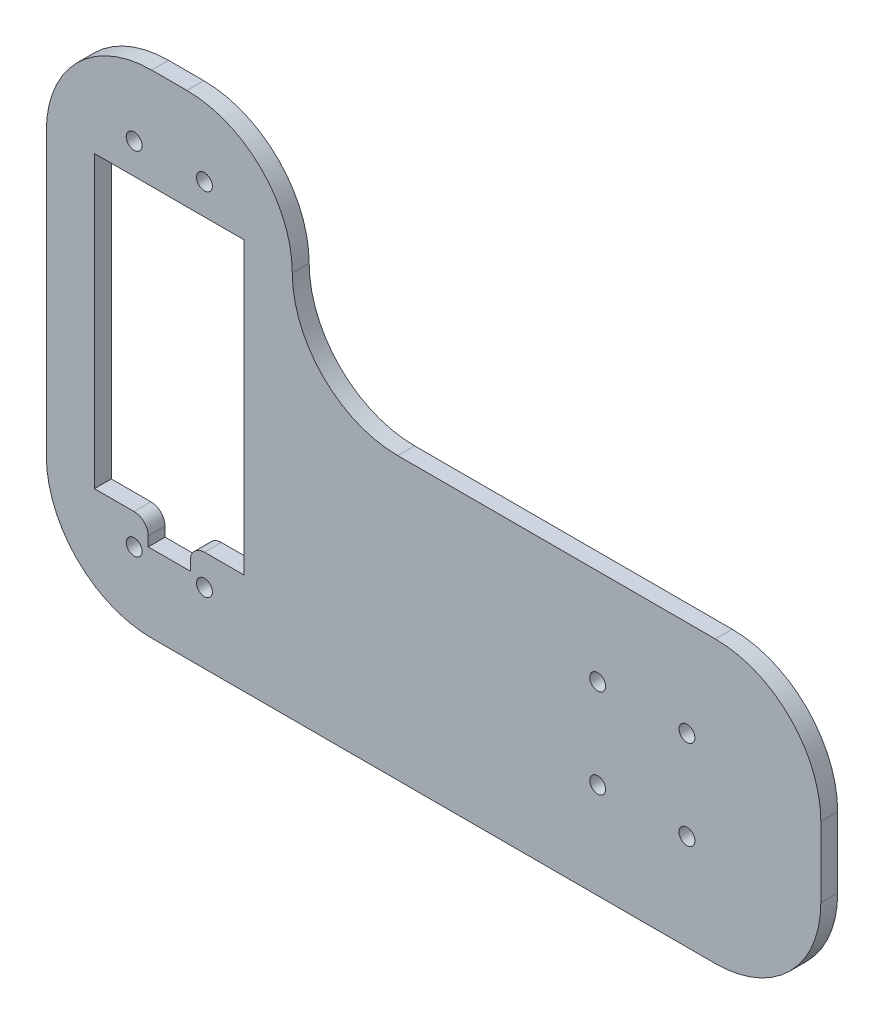
ISO-10303-21;
HEADER;
FILE_DESCRIPTION(('STEP AP214'),'2;1');
FILE_NAME('part.step','',(''),(''),'','','');
FILE_SCHEMA(('AUTOMOTIVE_DESIGN { 1 0 10303 214 1 1 1 1 }'));
ENDSEC;
DATA;
#1=APPLICATION_CONTEXT('core data for automotive mechanical design processes');
#2=APPLICATION_PROTOCOL_DEFINITION('international standard','automotive_design',2000,#1);
#3=PRODUCT_CONTEXT('',#1,'mechanical');
#4=PRODUCT('Part','Part','',(#3));
#5=PRODUCT_RELATED_PRODUCT_CATEGORY('part','',(#4));
#6=PRODUCT_DEFINITION_FORMATION('','',#4);
#7=PRODUCT_DEFINITION_CONTEXT('part definition',#1,'design');
#8=PRODUCT_DEFINITION('design','',#6,#7);
#9=PRODUCT_DEFINITION_SHAPE('','',#8);
#10=(LENGTH_UNIT() NAMED_UNIT(*) SI_UNIT(.MILLI.,.METRE.));
#11=(NAMED_UNIT(*) PLANE_ANGLE_UNIT() SI_UNIT($,.RADIAN.));
#12=(NAMED_UNIT(*) SI_UNIT($,.STERADIAN.) SOLID_ANGLE_UNIT());
#13=UNCERTAINTY_MEASURE_WITH_UNIT(LENGTH_MEASURE(1.E-05),#10,'distance_accuracy_value','');
#14=(GEOMETRIC_REPRESENTATION_CONTEXT(3) GLOBAL_UNCERTAINTY_ASSIGNED_CONTEXT((#13)) GLOBAL_UNIT_ASSIGNED_CONTEXT((#10,
#11,#12)) REPRESENTATION_CONTEXT('',''));
#15=CARTESIAN_POINT('',(0.,0.,0.));
#16=DIRECTION('',(0.,0.,1.));
#17=DIRECTION('',(1.,0.,0.));
#18=AXIS2_PLACEMENT_3D('',#15,#16,#17);
#19=CARTESIAN_POINT('',(0.,0.,2.4));
#20=DIRECTION('',(0.,0.,-1.));
#21=DIRECTION('',(-1.,0.,0.));
#22=AXIS2_PLACEMENT_3D('',#19,#20,#21);
#23=PLANE('',#22);
#24=DIRECTION('',(0.,1.,0.));
#25=VECTOR('',#24,1.);
#26=CARTESIAN_POINT('',(14.1329479768786,-17.9624277456648,2.4));
#27=LINE('',#26,#25);
#28=CARTESIAN_POINT('',(14.1329479768786,-42.9624277456647,2.4));
#29=VERTEX_POINT('',#28);
#30=CARTESIAN_POINT('',(14.1329479768786,-32.9624277456648,2.4));
#31=VERTEX_POINT('',#30);
#32=EDGE_CURVE('E302',#29,#31,#27,.T.);
#33=ORIENTED_EDGE('',*,*,#32,.T.);
#34=CARTESIAN_POINT('',(-0.867052023121387,-32.9624277456648,2.4));
#35=DIRECTION('',(0.,0.,-1.));
#36=DIRECTION('',(-1.,0.,0.));
#37=AXIS2_PLACEMENT_3D('',#34,#35,#36);
#38=CIRCLE('',#37,15.);
#39=CARTESIAN_POINT('',(-0.867052023121387,-17.9624277456648,2.4));
#40=VERTEX_POINT('',#39);
#41=EDGE_CURVE('E367',#31,#40,#38,.F.);
#42=ORIENTED_EDGE('',*,*,#41,.T.);
#43=DIRECTION('',(-1.,0.,0.));
#44=VECTOR('',#43,1.);
#45=CARTESIAN_POINT('',(-61.0670520231214,-17.9624277456648,2.4));
#46=LINE('',#45,#44);
#47=CARTESIAN_POINT('',(-46.0670520231214,-17.9624277456648,2.4));
#48=VERTEX_POINT('',#47);
#49=EDGE_CURVE('E305',#40,#48,#46,.T.);
#50=ORIENTED_EDGE('',*,*,#49,.T.);
#51=CARTESIAN_POINT('',(-46.0670520231214,-2.96242774566476,2.4));
#52=DIRECTION('',(0.,0.,-1.));
#53=DIRECTION('',(-1.,0.,0.));
#54=AXIS2_PLACEMENT_3D('',#51,#52,#53);
#55=CIRCLE('',#54,15.);
#56=CARTESIAN_POINT('',(-61.0670520231214,-2.96242774566475,2.4));
#57=VERTEX_POINT('',#56);
#58=EDGE_CURVE('E11',#48,#57,#55,.T.);
#59=ORIENTED_EDGE('',*,*,#58,.T.);
#60=CARTESIAN_POINT('',(-76.0670520231214,-2.96242774566476,2.4));
#61=DIRECTION('',(0.,0.,-1.));
#62=DIRECTION('',(-1.,0.,0.));
#63=AXIS2_PLACEMENT_3D('',#60,#61,#62);
#64=CIRCLE('',#63,15.);
#65=CARTESIAN_POINT('',(-76.0670520231214,12.0375722543352,2.4));
#66=VERTEX_POINT('',#65);
#67=EDGE_CURVE('E55',#57,#66,#64,.F.);
#68=ORIENTED_EDGE('',*,*,#67,.T.);
#69=DIRECTION('',(-1.,0.,0.));
#70=VECTOR('',#69,1.);
#71=CARTESIAN_POINT('',(-96.0670520231214,12.0375722543352,2.4));
#72=LINE('',#71,#70);
#73=CARTESIAN_POINT('',(-81.0670520231214,12.0375722543352,2.4));
#74=VERTEX_POINT('',#73);
#75=EDGE_CURVE('E308',#66,#74,#72,.T.);
#76=ORIENTED_EDGE('',*,*,#75,.T.);
#77=CARTESIAN_POINT('',(-81.0670520231214,-2.96242774566476,2.4));
#78=DIRECTION('',(0.,0.,-1.));
#79=DIRECTION('',(-1.,0.,0.));
#80=AXIS2_PLACEMENT_3D('',#77,#78,#79);
#81=CIRCLE('',#80,15.);
#82=CARTESIAN_POINT('',(-96.0670520231214,-2.96242774566476,2.4));
#83=VERTEX_POINT('',#82);
#84=EDGE_CURVE('E360',#74,#83,#81,.F.);
#85=ORIENTED_EDGE('',*,*,#84,.T.);
#86=DIRECTION('',(0.,-1.,0.));
#87=VECTOR('',#86,1.);
#88=CARTESIAN_POINT('',(-96.0670520231214,-57.9624277456648,2.4));
#89=LINE('',#88,#87);
#90=CARTESIAN_POINT('',(-96.0670520231214,-42.9624277456648,2.4));
#91=VERTEX_POINT('',#90);
#92=EDGE_CURVE('E295',#83,#91,#89,.T.);
#93=ORIENTED_EDGE('',*,*,#92,.T.);
#94=CARTESIAN_POINT('',(-81.0670520231214,-42.9624277456648,2.4));
#95=DIRECTION('',(0.,0.,-1.));
#96=DIRECTION('',(-1.,0.,0.));
#97=AXIS2_PLACEMENT_3D('',#94,#95,#96);
#98=CIRCLE('',#97,15.);
#99=CARTESIAN_POINT('',(-81.0670520231214,-57.9624277456648,2.4));
#100=VERTEX_POINT('',#99);
#101=EDGE_CURVE('E363',#91,#100,#98,.F.);
#102=ORIENTED_EDGE('',*,*,#101,.T.);
#103=DIRECTION('',(1.,0.,0.));
#104=VECTOR('',#103,1.);
#105=CARTESIAN_POINT('',(14.1329479768786,-57.9624277456647,2.4));
#106=LINE('',#105,#104);
#107=CARTESIAN_POINT('',(-0.867052023121383,-57.9624277456647,2.4));
#108=VERTEX_POINT('',#107);
#109=EDGE_CURVE('E298',#100,#108,#106,.T.);
#110=ORIENTED_EDGE('',*,*,#109,.T.);
#111=CARTESIAN_POINT('',(-0.867052023121389,-42.9624277456647,2.4));
#112=DIRECTION('',(0.,0.,-1.));
#113=DIRECTION('',(-1.,0.,0.));
#114=AXIS2_PLACEMENT_3D('',#111,#112,#113);
#115=CIRCLE('',#114,15.);
#116=EDGE_CURVE('E365',#108,#29,#115,.F.);
#117=ORIENTED_EDGE('',*,*,#116,.T.);
#118=EDGE_LOOP('',(#33,#42,#50,#59,#68,#76,#85,#93,#102,#110,#117));
#119=FACE_BOUND('',#118,.T.);
#120=DIRECTION('',(1.,0.,0.));
#121=VECTOR('',#120,1.);
#122=CARTESIAN_POINT('',(-89.2170520231214,-43.6124277456648,2.4));
#123=LINE('',#122,#121);
#124=CARTESIAN_POINT('',(-73.5670520231214,-43.6124277456648,2.4));
#125=VERTEX_POINT('',#124);
#126=CARTESIAN_POINT('',(-67.9170520231214,-43.6124277456648,2.4));
#127=VERTEX_POINT('',#126);
#128=EDGE_CURVE('E215',#125,#127,#123,.T.);
#129=ORIENTED_EDGE('',*,*,#128,.F.);
#130=CARTESIAN_POINT('',(-73.5670520231214,-45.6124277456648,2.4));
#131=DIRECTION('',(0.,0.,-1.));
#132=DIRECTION('',(-1.,0.,0.));
#133=AXIS2_PLACEMENT_3D('',#130,#131,#132);
#134=CIRCLE('',#133,2.);
#135=CARTESIAN_POINT('',(-75.5670520231214,-45.6124277456648,2.4));
#136=VERTEX_POINT('',#135);
#137=EDGE_CURVE('E333',#125,#136,#134,.F.);
#138=ORIENTED_EDGE('',*,*,#137,.T.);
#139=DIRECTION('',(0.,1.,0.));
#140=VECTOR('',#139,1.);
#141=CARTESIAN_POINT('',(-75.5670520231214,-42.9624277456648,2.4));
#142=LINE('',#141,#140);
#143=CARTESIAN_POINT('',(-75.5670520231214,-46.9624277456648,2.4));
#144=VERTEX_POINT('',#143);
#145=EDGE_CURVE('E230',#144,#136,#142,.T.);
#146=ORIENTED_EDGE('',*,*,#145,.F.);
#147=DIRECTION('',(1.,0.,0.));
#148=VECTOR('',#147,1.);
#149=CARTESIAN_POINT('',(-81.5670520231214,-46.9624277456648,2.4));
#150=LINE('',#149,#148);
#151=CARTESIAN_POINT('',(-81.5670520231214,-46.9624277456648,2.4));
#152=VERTEX_POINT('',#151);
#153=EDGE_CURVE('E237',#152,#144,#150,.T.);
#154=ORIENTED_EDGE('',*,*,#153,.F.);
#155=DIRECTION('',(0.,-1.,0.));
#156=VECTOR('',#155,1.);
#157=CARTESIAN_POINT('',(-81.5670520231214,-42.9624277456648,2.4));
#158=LINE('',#157,#156);
#159=CARTESIAN_POINT('',(-81.5670520231214,-45.6124277456648,2.4));
#160=VERTEX_POINT('',#159);
#161=EDGE_CURVE('E222',#160,#152,#158,.T.);
#162=ORIENTED_EDGE('',*,*,#161,.F.);
#163=CARTESIAN_POINT('',(-83.5670520231214,-45.6124277456648,2.4));
#164=DIRECTION('',(0.,0.,-1.));
#165=DIRECTION('',(-1.,0.,0.));
#166=AXIS2_PLACEMENT_3D('',#163,#164,#165);
#167=CIRCLE('',#166,2.);
#168=CARTESIAN_POINT('',(-83.5670520231214,-43.6124277456648,2.4));
#169=VERTEX_POINT('',#168);
#170=EDGE_CURVE('E331',#160,#169,#167,.F.);
#171=ORIENTED_EDGE('',*,*,#170,.T.);
#172=CARTESIAN_POINT('',(-89.2170520231214,-43.6124277456648,2.4));
#173=VERTEX_POINT('',#172);
#174=EDGE_CURVE('E216',#173,#169,#123,.T.);
#175=ORIENTED_EDGE('',*,*,#174,.F.);
#176=DIRECTION('',(0.,-1.,0.));
#177=VECTOR('',#176,1.);
#178=CARTESIAN_POINT('',(-89.2170520231214,-2.31242774566476,2.4));
#179=LINE('',#178,#177);
#180=CARTESIAN_POINT('',(-89.2170520231214,-2.31242774566476,2.4));
#181=VERTEX_POINT('',#180);
#182=EDGE_CURVE('E184',#181,#173,#179,.T.);
#183=ORIENTED_EDGE('',*,*,#182,.F.);
#184=DIRECTION('',(-1.,0.,0.));
#185=VECTOR('',#184,1.);
#186=CARTESIAN_POINT('',(-89.2170520231214,-2.31242774566476,2.4));
#187=LINE('',#186,#185);
#188=CARTESIAN_POINT('',(-67.9170520231214,-2.31242774566476,2.4));
#189=VERTEX_POINT('',#188);
#190=EDGE_CURVE('E206',#189,#181,#187,.T.);
#191=ORIENTED_EDGE('',*,*,#190,.F.);
#192=DIRECTION('',(0.,1.,0.));
#193=VECTOR('',#192,1.);
#194=CARTESIAN_POINT('',(-67.9170520231214,-2.31242774566476,2.4));
#195=LINE('',#194,#193);
#196=EDGE_CURVE('E209',#127,#189,#195,.T.);
#197=ORIENTED_EDGE('',*,*,#196,.F.);
#198=EDGE_LOOP('',(#129,#138,#146,#154,#162,#171,#175,#183,#191,#197));
#199=FACE_BOUND('',#198,.T.);
#200=CARTESIAN_POINT('',(-4.91705202312138,-31.6124277456648,2.4));
#201=DIRECTION('',(0.,0.,1.));
#202=DIRECTION('',(1.,0.,0.));
#203=AXIS2_PLACEMENT_3D('',#200,#201,#202);
#204=CIRCLE('',#203,1.13);
#205=CARTESIAN_POINT('',(-3.78705202312138,-31.6124277456648,2.4));
#206=VERTEX_POINT('',#205);
#207=EDGE_CURVE('E289',#206,#206,#204,.T.);
#208=ORIENTED_EDGE('',*,*,#207,.F.);
#209=EDGE_LOOP('',(#208));
#210=FACE_BOUND('',#209,.T.);
#211=CARTESIAN_POINT('',(-17.6170520231214,-31.6124277456648,2.4));
#212=DIRECTION('',(0.,0.,1.));
#213=DIRECTION('',(-1.,0.,0.));
#214=AXIS2_PLACEMENT_3D('',#211,#212,#213);
#215=CIRCLE('',#214,1.13);
#216=CARTESIAN_POINT('',(-18.7470520231214,-31.6124277456648,2.4));
#217=VERTEX_POINT('',#216);
#218=EDGE_CURVE('E283',#217,#217,#215,.T.);
#219=ORIENTED_EDGE('',*,*,#218,.F.);
#220=EDGE_LOOP('',(#219));
#221=FACE_BOUND('',#220,.T.);
#222=CARTESIAN_POINT('',(-73.5670520231214,-47.9624277456648,2.4));
#223=DIRECTION('',(0.,0.,1.));
#224=DIRECTION('',(1.,0.,0.));
#225=AXIS2_PLACEMENT_3D('',#222,#223,#224);
#226=CIRCLE('',#225,1.13000000000001);
#227=CARTESIAN_POINT('',(-72.4370520231214,-47.9624277456648,2.4));
#228=VERTEX_POINT('',#227);
#229=EDGE_CURVE('E277',#228,#228,#226,.T.);
#230=ORIENTED_EDGE('',*,*,#229,.F.);
#231=EDGE_LOOP('',(#230));
#232=FACE_BOUND('',#231,.T.);
#233=CARTESIAN_POINT('',(-17.6170520231214,-44.3124277456647,2.4));
#234=DIRECTION('',(0.,0.,1.));
#235=DIRECTION('',(1.,0.,0.));
#236=AXIS2_PLACEMENT_3D('',#233,#234,#235);
#237=CIRCLE('',#236,1.13);
#238=CARTESIAN_POINT('',(-16.4870520231214,-44.3124277456647,2.4));
#239=VERTEX_POINT('',#238);
#240=EDGE_CURVE('E271',#239,#239,#237,.T.);
#241=ORIENTED_EDGE('',*,*,#240,.F.);
#242=EDGE_LOOP('',(#241));
#243=FACE_BOUND('',#242,.T.);
#244=CARTESIAN_POINT('',(-4.91705202312138,-44.3124277456647,2.4));
#245=DIRECTION('',(0.,0.,1.));
#246=DIRECTION('',(-1.,0.,0.));
#247=AXIS2_PLACEMENT_3D('',#244,#245,#246);
#248=CIRCLE('',#247,1.13);
#249=CARTESIAN_POINT('',(-6.04705202312139,-44.3124277456647,2.4));
#250=VERTEX_POINT('',#249);
#251=EDGE_CURVE('E265',#250,#250,#248,.T.);
#252=ORIENTED_EDGE('',*,*,#251,.F.);
#253=EDGE_LOOP('',(#252));
#254=FACE_BOUND('',#253,.T.);
#255=CARTESIAN_POINT('',(-73.5670520231214,2.03757225433524,2.4));
#256=DIRECTION('',(0.,0.,1.));
#257=DIRECTION('',(1.,0.,0.));
#258=AXIS2_PLACEMENT_3D('',#255,#256,#257);
#259=CIRCLE('',#258,1.13000000000001);
#260=CARTESIAN_POINT('',(-72.4370520231214,2.03757225433524,2.4));
#261=VERTEX_POINT('',#260);
#262=EDGE_CURVE('E259',#261,#261,#259,.T.);
#263=ORIENTED_EDGE('',*,*,#262,.F.);
#264=EDGE_LOOP('',(#263));
#265=FACE_BOUND('',#264,.T.);
#266=CARTESIAN_POINT('',(-83.5670520231214,2.03757225433524,2.4));
#267=DIRECTION('',(0.,0.,1.));
#268=DIRECTION('',(-1.,0.,0.));
#269=AXIS2_PLACEMENT_3D('',#266,#267,#268);
#270=CIRCLE('',#269,1.13);
#271=CARTESIAN_POINT('',(-84.6970520231214,2.03757225433524,2.4));
#272=VERTEX_POINT('',#271);
#273=EDGE_CURVE('E253',#272,#272,#270,.T.);
#274=ORIENTED_EDGE('',*,*,#273,.F.);
#275=EDGE_LOOP('',(#274));
#276=FACE_BOUND('',#275,.T.);
#277=CARTESIAN_POINT('',(-83.5670520231214,-47.9624277456648,2.4));
#278=DIRECTION('',(0.,0.,1.));
#279=DIRECTION('',(-1.,0.,0.));
#280=AXIS2_PLACEMENT_3D('',#277,#278,#279);
#281=CIRCLE('',#280,1.12999999999999);
#282=CARTESIAN_POINT('',(-84.6970520231214,-47.9624277456648,2.4));
#283=VERTEX_POINT('',#282);
#284=EDGE_CURVE('E247',#283,#283,#281,.T.);
#285=ORIENTED_EDGE('',*,*,#284,.F.);
#286=EDGE_LOOP('',(#285));
#287=FACE_BOUND('',#286,.T.);
#288=ADVANCED_FACE('F33',(#119,#199,#210,#221,#232,#243,#254,#265,#276,#287),#23,.F.);
#289=CARTESIAN_POINT('',(0.,0.,0.));
#290=DIRECTION('',(0.,0.,-1.));
#291=DIRECTION('',(-1.,0.,0.));
#292=AXIS2_PLACEMENT_3D('',#289,#290,#291);
#293=PLANE('',#292);
#294=DIRECTION('',(0.,1.,0.));
#295=VECTOR('',#294,1.);
#296=CARTESIAN_POINT('',(-75.5670520231214,-42.9624277456648,0.));
#297=LINE('',#296,#295);
#298=CARTESIAN_POINT('',(-75.5670520231214,-46.9624277456648,0.));
#299=VERTEX_POINT('',#298);
#300=CARTESIAN_POINT('',(-75.5670520231214,-45.6124277456648,0.));
#301=VERTEX_POINT('',#300);
#302=EDGE_CURVE('E233',#299,#301,#297,.T.);
#303=ORIENTED_EDGE('',*,*,#302,.T.);
#304=CARTESIAN_POINT('',(-73.5670520231214,-45.6124277456648,0.));
#305=DIRECTION('',(0.,0.,-1.));
#306=DIRECTION('',(-1.,0.,0.));
#307=AXIS2_PLACEMENT_3D('',#304,#305,#306);
#308=CIRCLE('',#307,2.);
#309=CARTESIAN_POINT('',(-73.5670520231214,-43.6124277456648,0.));
#310=VERTEX_POINT('',#309);
#311=EDGE_CURVE('E327',#301,#310,#308,.T.);
#312=ORIENTED_EDGE('',*,*,#311,.T.);
#313=DIRECTION('',(1.,0.,0.));
#314=VECTOR('',#313,1.);
#315=CARTESIAN_POINT('',(-89.2170520231214,-43.6124277456648,0.));
#316=LINE('',#315,#314);
#317=CARTESIAN_POINT('',(-67.9170520231214,-43.6124277456648,0.));
#318=VERTEX_POINT('',#317);
#319=EDGE_CURVE('E199',#310,#318,#316,.T.);
#320=ORIENTED_EDGE('',*,*,#319,.T.);
#321=DIRECTION('',(0.,1.,0.));
#322=VECTOR('',#321,1.);
#323=CARTESIAN_POINT('',(-67.9170520231214,-2.31242774566476,0.));
#324=LINE('',#323,#322);
#325=CARTESIAN_POINT('',(-67.9170520231214,-2.31242774566476,0.));
#326=VERTEX_POINT('',#325);
#327=EDGE_CURVE('E198',#318,#326,#324,.T.);
#328=ORIENTED_EDGE('',*,*,#327,.T.);
#329=DIRECTION('',(-1.,0.,0.));
#330=VECTOR('',#329,1.);
#331=CARTESIAN_POINT('',(-89.2170520231214,-2.31242774566476,0.));
#332=LINE('',#331,#330);
#333=CARTESIAN_POINT('',(-89.2170520231214,-2.31242774566476,0.));
#334=VERTEX_POINT('',#333);
#335=EDGE_CURVE('E189',#326,#334,#332,.T.);
#336=ORIENTED_EDGE('',*,*,#335,.T.);
#337=DIRECTION('',(0.,-1.,0.));
#338=VECTOR('',#337,1.);
#339=CARTESIAN_POINT('',(-89.2170520231214,-2.31242774566476,0.));
#340=LINE('',#339,#338);
#341=CARTESIAN_POINT('',(-89.2170520231214,-43.6124277456648,0.));
#342=VERTEX_POINT('',#341);
#343=EDGE_CURVE('E181',#334,#342,#340,.T.);
#344=ORIENTED_EDGE('',*,*,#343,.T.);
#345=CARTESIAN_POINT('',(-83.5670520231214,-43.6124277456648,0.));
#346=VERTEX_POINT('',#345);
#347=EDGE_CURVE('E192',#342,#346,#316,.T.);
#348=ORIENTED_EDGE('',*,*,#347,.T.);
#349=CARTESIAN_POINT('',(-83.5670520231214,-45.6124277456648,0.));
#350=DIRECTION('',(0.,0.,-1.));
#351=DIRECTION('',(-1.,0.,0.));
#352=AXIS2_PLACEMENT_3D('',#349,#350,#351);
#353=CIRCLE('',#352,2.);
#354=CARTESIAN_POINT('',(-81.5670520231214,-45.6124277456648,0.));
#355=VERTEX_POINT('',#354);
#356=EDGE_CURVE('E325',#346,#355,#353,.T.);
#357=ORIENTED_EDGE('',*,*,#356,.T.);
#358=DIRECTION('',(0.,-1.,0.));
#359=VECTOR('',#358,1.);
#360=CARTESIAN_POINT('',(-81.5670520231214,-42.9624277456648,0.));
#361=LINE('',#360,#359);
#362=CARTESIAN_POINT('',(-81.5670520231214,-46.9624277456648,0.));
#363=VERTEX_POINT('',#362);
#364=EDGE_CURVE('E227',#355,#363,#361,.T.);
#365=ORIENTED_EDGE('',*,*,#364,.T.);
#366=DIRECTION('',(1.,0.,0.));
#367=VECTOR('',#366,1.);
#368=CARTESIAN_POINT('',(-81.5670520231214,-46.9624277456648,0.));
#369=LINE('',#368,#367);
#370=EDGE_CURVE('E229',#363,#299,#369,.T.);
#371=ORIENTED_EDGE('',*,*,#370,.T.);
#372=EDGE_LOOP('',(#303,#312,#320,#328,#336,#344,#348,#357,#365,#371));
#373=FACE_BOUND('',#372,.T.);
#374=CARTESIAN_POINT('',(-83.5670520231214,2.03757225433524,0.));
#375=DIRECTION('',(0.,0.,1.));
#376=DIRECTION('',(-1.,0.,0.));
#377=AXIS2_PLACEMENT_3D('',#374,#375,#376);
#378=CIRCLE('',#377,1.13);
#379=CARTESIAN_POINT('',(-84.6970520231214,2.03757225433524,0.));
#380=VERTEX_POINT('',#379);
#381=EDGE_CURVE('E250',#380,#380,#378,.T.);
#382=ORIENTED_EDGE('',*,*,#381,.T.);
#383=EDGE_LOOP('',(#382));
#384=FACE_BOUND('',#383,.T.);
#385=CARTESIAN_POINT('',(-4.91705202312138,-44.3124277456647,0.));
#386=DIRECTION('',(0.,0.,1.));
#387=DIRECTION('',(-1.,0.,0.));
#388=AXIS2_PLACEMENT_3D('',#385,#386,#387);
#389=CIRCLE('',#388,1.13);
#390=CARTESIAN_POINT('',(-6.04705202312139,-44.3124277456647,0.));
#391=VERTEX_POINT('',#390);
#392=EDGE_CURVE('E262',#391,#391,#389,.T.);
#393=ORIENTED_EDGE('',*,*,#392,.T.);
#394=EDGE_LOOP('',(#393));
#395=FACE_BOUND('',#394,.T.);
#396=CARTESIAN_POINT('',(-73.5670520231214,-47.9624277456648,0.));
#397=DIRECTION('',(0.,0.,1.));
#398=DIRECTION('',(1.,0.,0.));
#399=AXIS2_PLACEMENT_3D('',#396,#397,#398);
#400=CIRCLE('',#399,1.13000000000001);
#401=CARTESIAN_POINT('',(-72.4370520231214,-47.9624277456648,0.));
#402=VERTEX_POINT('',#401);
#403=EDGE_CURVE('E274',#402,#402,#400,.T.);
#404=ORIENTED_EDGE('',*,*,#403,.T.);
#405=EDGE_LOOP('',(#404));
#406=FACE_BOUND('',#405,.T.);
#407=CARTESIAN_POINT('',(-4.91705202312138,-31.6124277456648,0.));
#408=DIRECTION('',(0.,0.,1.));
#409=DIRECTION('',(1.,0.,0.));
#410=AXIS2_PLACEMENT_3D('',#407,#408,#409);
#411=CIRCLE('',#410,1.13);
#412=CARTESIAN_POINT('',(-3.78705202312138,-31.6124277456648,0.));
#413=VERTEX_POINT('',#412);
#414=EDGE_CURVE('E286',#413,#413,#411,.T.);
#415=ORIENTED_EDGE('',*,*,#414,.T.);
#416=EDGE_LOOP('',(#415));
#417=FACE_BOUND('',#416,.T.);
#418=DIRECTION('',(-1.,0.,0.));
#419=VECTOR('',#418,1.);
#420=CARTESIAN_POINT('',(-61.0670520231214,-17.9624277456648,0.));
#421=LINE('',#420,#419);
#422=CARTESIAN_POINT('',(-0.867052023121387,-17.9624277456648,0.));
#423=VERTEX_POINT('',#422);
#424=CARTESIAN_POINT('',(-46.0670520231214,-17.9624277456648,0.));
#425=VERTEX_POINT('',#424);
#426=EDGE_CURVE('E319',#423,#425,#421,.T.);
#427=ORIENTED_EDGE('',*,*,#426,.F.);
#428=CARTESIAN_POINT('',(-0.867052023121387,-32.9624277456648,0.));
#429=DIRECTION('',(0.,0.,-1.));
#430=DIRECTION('',(-1.,0.,0.));
#431=AXIS2_PLACEMENT_3D('',#428,#429,#430);
#432=CIRCLE('',#431,15.);
#433=CARTESIAN_POINT('',(14.1329479768786,-32.9624277456648,0.));
#434=VERTEX_POINT('',#433);
#435=EDGE_CURVE('E353',#423,#434,#432,.T.);
#436=ORIENTED_EDGE('',*,*,#435,.T.);
#437=DIRECTION('',(0.,1.,0.));
#438=VECTOR('',#437,1.);
#439=CARTESIAN_POINT('',(14.1329479768786,-17.9624277456648,0.));
#440=LINE('',#439,#438);
#441=CARTESIAN_POINT('',(14.1329479768786,-42.9624277456647,0.));
#442=VERTEX_POINT('',#441);
#443=EDGE_CURVE('E316',#442,#434,#440,.T.);
#444=ORIENTED_EDGE('',*,*,#443,.F.);
#445=CARTESIAN_POINT('',(-0.867052023121389,-42.9624277456647,0.));
#446=DIRECTION('',(0.,0.,-1.));
#447=DIRECTION('',(-1.,0.,0.));
#448=AXIS2_PLACEMENT_3D('',#445,#446,#447);
#449=CIRCLE('',#448,15.);
#450=CARTESIAN_POINT('',(-0.867052023121383,-57.9624277456647,0.));
#451=VERTEX_POINT('',#450);
#452=EDGE_CURVE('E351',#442,#451,#449,.T.);
#453=ORIENTED_EDGE('',*,*,#452,.T.);
#454=DIRECTION('',(1.,0.,0.));
#455=VECTOR('',#454,1.);
#456=CARTESIAN_POINT('',(14.1329479768786,-57.9624277456647,0.));
#457=LINE('',#456,#455);
#458=CARTESIAN_POINT('',(-81.0670520231214,-57.9624277456648,0.));
#459=VERTEX_POINT('',#458);
#460=EDGE_CURVE('E313',#459,#451,#457,.T.);
#461=ORIENTED_EDGE('',*,*,#460,.F.);
#462=CARTESIAN_POINT('',(-81.0670520231214,-42.9624277456648,0.));
#463=DIRECTION('',(0.,0.,-1.));
#464=DIRECTION('',(-1.,0.,0.));
#465=AXIS2_PLACEMENT_3D('',#462,#463,#464);
#466=CIRCLE('',#465,15.);
#467=CARTESIAN_POINT('',(-96.0670520231214,-42.9624277456648,0.));
#468=VERTEX_POINT('',#467);
#469=EDGE_CURVE('E349',#459,#468,#466,.T.);
#470=ORIENTED_EDGE('',*,*,#469,.T.);
#471=DIRECTION('',(0.,-1.,0.));
#472=VECTOR('',#471,1.);
#473=CARTESIAN_POINT('',(-96.0670520231214,-57.9624277456648,0.));
#474=LINE('',#473,#472);
#475=CARTESIAN_POINT('',(-96.0670520231214,-2.96242774566476,0.));
#476=VERTEX_POINT('',#475);
#477=EDGE_CURVE('E292',#476,#468,#474,.T.);
#478=ORIENTED_EDGE('',*,*,#477,.F.);
#479=CARTESIAN_POINT('',(-81.0670520231214,-2.96242774566476,0.));
#480=DIRECTION('',(0.,0.,-1.));
#481=DIRECTION('',(-1.,0.,0.));
#482=AXIS2_PLACEMENT_3D('',#479,#480,#481);
#483=CIRCLE('',#482,15.);
#484=CARTESIAN_POINT('',(-81.0670520231214,12.0375722543352,0.));
#485=VERTEX_POINT('',#484);
#486=EDGE_CURVE('E345',#476,#485,#483,.T.);
#487=ORIENTED_EDGE('',*,*,#486,.T.);
#488=DIRECTION('',(-1.,0.,0.));
#489=VECTOR('',#488,1.);
#490=CARTESIAN_POINT('',(-96.0670520231214,12.0375722543352,0.));
#491=LINE('',#490,#489);
#492=CARTESIAN_POINT('',(-76.0670520231214,12.0375722543352,0.));
#493=VERTEX_POINT('',#492);
#494=EDGE_CURVE('E299',#493,#485,#491,.T.);
#495=ORIENTED_EDGE('',*,*,#494,.F.);
#496=CARTESIAN_POINT('',(-76.0670520231214,-2.96242774566476,0.));
#497=DIRECTION('',(0.,0.,-1.));
#498=DIRECTION('',(-1.,0.,0.));
#499=AXIS2_PLACEMENT_3D('',#496,#497,#498);
#500=CIRCLE('',#499,15.);
#501=CARTESIAN_POINT('',(-61.0670520231214,-2.96242774566475,0.));
#502=VERTEX_POINT('',#501);
#503=EDGE_CURVE('E347',#493,#502,#500,.T.);
#504=ORIENTED_EDGE('',*,*,#503,.T.);
#505=CARTESIAN_POINT('',(-46.0670520231214,-2.96242774566476,0.));
#506=DIRECTION('',(0.,0.,-1.));
#507=DIRECTION('',(-1.,0.,0.));
#508=AXIS2_PLACEMENT_3D('',#505,#506,#507);
#509=CIRCLE('',#508,15.);
#510=EDGE_CURVE('E42',#502,#425,#509,.F.);
#511=ORIENTED_EDGE('',*,*,#510,.T.);
#512=EDGE_LOOP('',(#427,#436,#444,#453,#461,#470,#478,#487,#495,#504,#511));
#513=FACE_BOUND('',#512,.T.);
#514=CARTESIAN_POINT('',(-17.6170520231214,-31.6124277456648,0.));
#515=DIRECTION('',(0.,0.,1.));
#516=DIRECTION('',(-1.,0.,0.));
#517=AXIS2_PLACEMENT_3D('',#514,#515,#516);
#518=CIRCLE('',#517,1.13);
#519=CARTESIAN_POINT('',(-18.7470520231214,-31.6124277456648,0.));
#520=VERTEX_POINT('',#519);
#521=EDGE_CURVE('E280',#520,#520,#518,.T.);
#522=ORIENTED_EDGE('',*,*,#521,.T.);
#523=EDGE_LOOP('',(#522));
#524=FACE_BOUND('',#523,.T.);
#525=CARTESIAN_POINT('',(-17.6170520231214,-44.3124277456647,0.));
#526=DIRECTION('',(0.,0.,1.));
#527=DIRECTION('',(1.,0.,0.));
#528=AXIS2_PLACEMENT_3D('',#525,#526,#527);
#529=CIRCLE('',#528,1.13);
#530=CARTESIAN_POINT('',(-16.4870520231214,-44.3124277456647,0.));
#531=VERTEX_POINT('',#530);
#532=EDGE_CURVE('E268',#531,#531,#529,.T.);
#533=ORIENTED_EDGE('',*,*,#532,.T.);
#534=EDGE_LOOP('',(#533));
#535=FACE_BOUND('',#534,.T.);
#536=CARTESIAN_POINT('',(-73.5670520231214,2.03757225433524,0.));
#537=DIRECTION('',(0.,0.,1.));
#538=DIRECTION('',(1.,0.,0.));
#539=AXIS2_PLACEMENT_3D('',#536,#537,#538);
#540=CIRCLE('',#539,1.13000000000001);
#541=CARTESIAN_POINT('',(-72.4370520231214,2.03757225433524,0.));
#542=VERTEX_POINT('',#541);
#543=EDGE_CURVE('E256',#542,#542,#540,.T.);
#544=ORIENTED_EDGE('',*,*,#543,.T.);
#545=EDGE_LOOP('',(#544));
#546=FACE_BOUND('',#545,.T.);
#547=CARTESIAN_POINT('',(-83.5670520231214,-47.9624277456648,0.));
#548=DIRECTION('',(0.,0.,1.));
#549=DIRECTION('',(-1.,0.,0.));
#550=AXIS2_PLACEMENT_3D('',#547,#548,#549);
#551=CIRCLE('',#550,1.12999999999999);
#552=CARTESIAN_POINT('',(-84.6970520231214,-47.9624277456648,0.));
#553=VERTEX_POINT('',#552);
#554=EDGE_CURVE('E244',#553,#553,#551,.T.);
#555=ORIENTED_EDGE('',*,*,#554,.T.);
#556=EDGE_LOOP('',(#555));
#557=FACE_BOUND('',#556,.T.);
#558=ADVANCED_FACE('F202',(#373,#384,#395,#406,#417,#513,#524,#535,#546,#557),#293,.T.);
#559=CARTESIAN_POINT('',(-96.0670520231214,-57.9624277456648,2.4));
#560=DIRECTION('',(1.,0.,0.));
#561=DIRECTION('',(0.,0.,-1.));
#562=AXIS2_PLACEMENT_3D('',#559,#560,#561);
#563=PLANE('',#562);
#564=ORIENTED_EDGE('',*,*,#477,.T.);
#565=DIRECTION('',(0.,0.,-1.));
#566=VECTOR('',#565,1.);
#567=CARTESIAN_POINT('',(-96.0670520231214,-42.9624277456648,2.4));
#568=LINE('',#567,#566);
#569=EDGE_CURVE('E377',#468,#91,#568,.F.);
#570=ORIENTED_EDGE('',*,*,#569,.T.);
#571=ORIENTED_EDGE('',*,*,#92,.F.);
#572=DIRECTION('',(0.,0.,-1.));
#573=VECTOR('',#572,1.);
#574=CARTESIAN_POINT('',(-96.0670520231214,-2.96242774566476,2.4));
#575=LINE('',#574,#573);
#576=EDGE_CURVE('E374',#83,#476,#575,.T.);
#577=ORIENTED_EDGE('',*,*,#576,.T.);
#578=EDGE_LOOP('',(#564,#570,#571,#577));
#579=FACE_BOUND('',#578,.T.);
#580=ADVANCED_FACE('F408',(#579),#563,.F.);
#581=CARTESIAN_POINT('',(14.1329479768786,-57.9624277456647,2.4));
#582=DIRECTION('',(0.,1.,0.));
#583=DIRECTION('',(-1.,0.,0.));
#584=AXIS2_PLACEMENT_3D('',#581,#582,#583);
#585=PLANE('',#584);
#586=ORIENTED_EDGE('',*,*,#460,.T.);
#587=DIRECTION('',(0.,0.,-1.));
#588=VECTOR('',#587,1.);
#589=CARTESIAN_POINT('',(-0.867052023121383,-57.9624277456647,2.4));
#590=LINE('',#589,#588);
#591=EDGE_CURVE('E372',#451,#108,#590,.F.);
#592=ORIENTED_EDGE('',*,*,#591,.T.);
#593=ORIENTED_EDGE('',*,*,#109,.F.);
#594=DIRECTION('',(0.,0.,-1.));
#595=VECTOR('',#594,1.);
#596=CARTESIAN_POINT('',(-81.0670520231214,-57.9624277456648,2.4));
#597=LINE('',#596,#595);
#598=EDGE_CURVE('E369',#100,#459,#597,.T.);
#599=ORIENTED_EDGE('',*,*,#598,.T.);
#600=EDGE_LOOP('',(#586,#592,#593,#599));
#601=FACE_BOUND('',#600,.T.);
#602=ADVANCED_FACE('F417',(#601),#585,.F.);
#603=CARTESIAN_POINT('',(14.1329479768786,-17.9624277456648,2.4));
#604=DIRECTION('',(-1.,0.,0.));
#605=DIRECTION('',(0.,0.,1.));
#606=AXIS2_PLACEMENT_3D('',#603,#604,#605);
#607=PLANE('',#606);
#608=ORIENTED_EDGE('',*,*,#443,.T.);
#609=DIRECTION('',(0.,0.,-1.));
#610=VECTOR('',#609,1.);
#611=CARTESIAN_POINT('',(14.1329479768786,-32.9624277456648,2.4));
#612=LINE('',#611,#610);
#613=EDGE_CURVE('E358',#434,#31,#612,.F.);
#614=ORIENTED_EDGE('',*,*,#613,.T.);
#615=ORIENTED_EDGE('',*,*,#32,.F.);
#616=DIRECTION('',(0.,0.,-1.));
#617=VECTOR('',#616,1.);
#618=CARTESIAN_POINT('',(14.1329479768786,-42.9624277456647,2.4));
#619=LINE('',#618,#617);
#620=EDGE_CURVE('E355',#29,#442,#619,.T.);
#621=ORIENTED_EDGE('',*,*,#620,.T.);
#622=EDGE_LOOP('',(#608,#614,#615,#621));
#623=FACE_BOUND('',#622,.T.);
#624=ADVANCED_FACE('F426',(#623),#607,.F.);
#625=CARTESIAN_POINT('',(-61.0670520231214,-17.9624277456648,2.4));
#626=DIRECTION('',(0.,-1.,0.));
#627=DIRECTION('',(1.,0.,0.));
#628=AXIS2_PLACEMENT_3D('',#625,#626,#627);
#629=PLANE('',#628);
#630=ORIENTED_EDGE('',*,*,#426,.T.);
#631=DIRECTION('',(0.,0.,-1.));
#632=VECTOR('',#631,1.);
#633=CARTESIAN_POINT('',(-46.0670520231214,-17.9624277456648,2.4));
#634=LINE('',#633,#632);
#635=EDGE_CURVE('E342',#425,#48,#634,.F.);
#636=ORIENTED_EDGE('',*,*,#635,.T.);
#637=ORIENTED_EDGE('',*,*,#49,.F.);
#638=DIRECTION('',(0.,0.,-1.));
#639=VECTOR('',#638,1.);
#640=CARTESIAN_POINT('',(-0.867052023121387,-17.9624277456648,2.4));
#641=LINE('',#640,#639);
#642=EDGE_CURVE('E339',#40,#423,#641,.T.);
#643=ORIENTED_EDGE('',*,*,#642,.T.);
#644=EDGE_LOOP('',(#630,#636,#637,#643));
#645=FACE_BOUND('',#644,.T.);
#646=ADVANCED_FACE('F393',(#645),#629,.F.);
#647=CARTESIAN_POINT('',(-96.0670520231214,12.0375722543352,2.4));
#648=DIRECTION('',(0.,-1.,0.));
#649=DIRECTION('',(1.,0.,0.));
#650=AXIS2_PLACEMENT_3D('',#647,#648,#649);
#651=PLANE('',#650);
#652=ORIENTED_EDGE('',*,*,#75,.F.);
#653=DIRECTION('',(0.,0.,-1.));
#654=VECTOR('',#653,1.);
#655=CARTESIAN_POINT('',(-76.0670520231214,12.0375722543352,2.4));
#656=LINE('',#655,#654);
#657=EDGE_CURVE('E380',#66,#493,#656,.T.);
#658=ORIENTED_EDGE('',*,*,#657,.T.);
#659=ORIENTED_EDGE('',*,*,#494,.T.);
#660=DIRECTION('',(0.,0.,-1.));
#661=VECTOR('',#660,1.);
#662=CARTESIAN_POINT('',(-81.0670520231214,12.0375722543352,2.4));
#663=LINE('',#662,#661);
#664=EDGE_CURVE('E49',#485,#74,#663,.F.);
#665=ORIENTED_EDGE('',*,*,#664,.T.);
#666=EDGE_LOOP('',(#652,#658,#659,#665));
#667=FACE_BOUND('',#666,.T.);
#668=ADVANCED_FACE('F401',(#667),#651,.F.);
#669=CARTESIAN_POINT('',(-4.91705202312138,-31.6124277456648,2.4));
#670=DIRECTION('',(0.,0.,-1.));
#671=DIRECTION('',(-1.,0.,0.));
#672=AXIS2_PLACEMENT_3D('',#669,#670,#671);
#673=CYLINDRICAL_SURFACE('',#672,1.13);
#674=ORIENTED_EDGE('',*,*,#207,.T.);
#675=EDGE_LOOP('',(#674));
#676=FACE_BOUND('',#675,.T.);
#677=ORIENTED_EDGE('',*,*,#414,.F.);
#678=EDGE_LOOP('',(#677));
#679=FACE_BOUND('',#678,.T.);
#680=ADVANCED_FACE('F448',(#676,#679),#673,.F.);
#681=CARTESIAN_POINT('',(-17.6170520231214,-31.6124277456648,2.4));
#682=DIRECTION('',(0.,0.,-1.));
#683=DIRECTION('',(-1.,0.,0.));
#684=AXIS2_PLACEMENT_3D('',#681,#682,#683);
#685=CYLINDRICAL_SURFACE('',#684,1.13);
#686=ORIENTED_EDGE('',*,*,#218,.T.);
#687=EDGE_LOOP('',(#686));
#688=FACE_BOUND('',#687,.T.);
#689=ORIENTED_EDGE('',*,*,#521,.F.);
#690=EDGE_LOOP('',(#689));
#691=FACE_BOUND('',#690,.T.);
#692=ADVANCED_FACE('F634',(#688,#691),#685,.F.);
#693=CARTESIAN_POINT('',(-73.5670520231214,-47.9624277456648,2.4));
#694=DIRECTION('',(0.,0.,-1.));
#695=DIRECTION('',(-1.,0.,0.));
#696=AXIS2_PLACEMENT_3D('',#693,#694,#695);
#697=CYLINDRICAL_SURFACE('',#696,1.13000000000001);
#698=ORIENTED_EDGE('',*,*,#229,.T.);
#699=EDGE_LOOP('',(#698));
#700=FACE_BOUND('',#699,.T.);
#701=ORIENTED_EDGE('',*,*,#403,.F.);
#702=EDGE_LOOP('',(#701));
#703=FACE_BOUND('',#702,.T.);
#704=ADVANCED_FACE('F625',(#700,#703),#697,.F.);
#705=CARTESIAN_POINT('',(-17.6170520231214,-44.3124277456647,2.4));
#706=DIRECTION('',(0.,0.,-1.));
#707=DIRECTION('',(-1.,0.,0.));
#708=AXIS2_PLACEMENT_3D('',#705,#706,#707);
#709=CYLINDRICAL_SURFACE('',#708,1.13);
#710=ORIENTED_EDGE('',*,*,#240,.T.);
#711=EDGE_LOOP('',(#710));
#712=FACE_BOUND('',#711,.T.);
#713=ORIENTED_EDGE('',*,*,#532,.F.);
#714=EDGE_LOOP('',(#713));
#715=FACE_BOUND('',#714,.T.);
#716=ADVANCED_FACE('F616',(#712,#715),#709,.F.);
#717=CARTESIAN_POINT('',(-4.91705202312138,-44.3124277456647,2.4));
#718=DIRECTION('',(0.,0.,-1.));
#719=DIRECTION('',(-1.,0.,0.));
#720=AXIS2_PLACEMENT_3D('',#717,#718,#719);
#721=CYLINDRICAL_SURFACE('',#720,1.13);
#722=ORIENTED_EDGE('',*,*,#251,.T.);
#723=EDGE_LOOP('',(#722));
#724=FACE_BOUND('',#723,.T.);
#725=ORIENTED_EDGE('',*,*,#392,.F.);
#726=EDGE_LOOP('',(#725));
#727=FACE_BOUND('',#726,.T.);
#728=ADVANCED_FACE('F607',(#724,#727),#721,.F.);
#729=CARTESIAN_POINT('',(-73.5670520231214,2.03757225433524,2.4));
#730=DIRECTION('',(0.,0.,-1.));
#731=DIRECTION('',(-1.,0.,0.));
#732=AXIS2_PLACEMENT_3D('',#729,#730,#731);
#733=CYLINDRICAL_SURFACE('',#732,1.13000000000001);
#734=ORIENTED_EDGE('',*,*,#262,.T.);
#735=EDGE_LOOP('',(#734));
#736=FACE_BOUND('',#735,.T.);
#737=ORIENTED_EDGE('',*,*,#543,.F.);
#738=EDGE_LOOP('',(#737));
#739=FACE_BOUND('',#738,.T.);
#740=ADVANCED_FACE('F598',(#736,#739),#733,.F.);
#741=CARTESIAN_POINT('',(-83.5670520231214,2.03757225433524,2.4));
#742=DIRECTION('',(0.,0.,-1.));
#743=DIRECTION('',(-1.,0.,0.));
#744=AXIS2_PLACEMENT_3D('',#741,#742,#743);
#745=CYLINDRICAL_SURFACE('',#744,1.13);
#746=ORIENTED_EDGE('',*,*,#273,.T.);
#747=EDGE_LOOP('',(#746));
#748=FACE_BOUND('',#747,.T.);
#749=ORIENTED_EDGE('',*,*,#381,.F.);
#750=EDGE_LOOP('',(#749));
#751=FACE_BOUND('',#750,.T.);
#752=ADVANCED_FACE('F589',(#748,#751),#745,.F.);
#753=CARTESIAN_POINT('',(-83.5670520231214,-47.9624277456648,2.4));
#754=DIRECTION('',(0.,0.,-1.));
#755=DIRECTION('',(-1.,0.,0.));
#756=AXIS2_PLACEMENT_3D('',#753,#754,#755);
#757=CYLINDRICAL_SURFACE('',#756,1.12999999999999);
#758=ORIENTED_EDGE('',*,*,#284,.T.);
#759=EDGE_LOOP('',(#758));
#760=FACE_BOUND('',#759,.T.);
#761=ORIENTED_EDGE('',*,*,#554,.F.);
#762=EDGE_LOOP('',(#761));
#763=FACE_BOUND('',#762,.T.);
#764=ADVANCED_FACE('F581',(#760,#763),#757,.F.);
#765=CARTESIAN_POINT('',(-81.5670520231214,-42.9624277456648,0.));
#766=DIRECTION('',(-1.,0.,0.));
#767=DIRECTION('',(0.,0.,1.));
#768=AXIS2_PLACEMENT_3D('',#765,#766,#767);
#769=PLANE('',#768);
#770=ORIENTED_EDGE('',*,*,#364,.F.);
#771=DIRECTION('',(0.,0.,1.));
#772=VECTOR('',#771,1.);
#773=CARTESIAN_POINT('',(-81.5670520231214,-45.6124277456648,0.));
#774=LINE('',#773,#772);
#775=EDGE_CURVE('E335',#355,#160,#774,.T.);
#776=ORIENTED_EDGE('',*,*,#775,.T.);
#777=ORIENTED_EDGE('',*,*,#161,.T.);
#778=DIRECTION('',(0.,0.,1.));
#779=VECTOR('',#778,1.);
#780=CARTESIAN_POINT('',(-81.5670520231214,-46.9624277456648,0.));
#781=LINE('',#780,#779);
#782=EDGE_CURVE('E235',#363,#152,#781,.T.);
#783=ORIENTED_EDGE('',*,*,#782,.F.);
#784=EDGE_LOOP('',(#770,#776,#777,#783));
#785=FACE_BOUND('',#784,.T.);
#786=ADVANCED_FACE('F573',(#785),#769,.F.);
#787=CARTESIAN_POINT('',(-75.5670520231214,-42.9624277456648,0.));
#788=DIRECTION('',(1.,0.,0.));
#789=DIRECTION('',(0.,0.,-1.));
#790=AXIS2_PLACEMENT_3D('',#787,#788,#789);
#791=PLANE('',#790);
#792=ORIENTED_EDGE('',*,*,#145,.T.);
#793=DIRECTION('',(0.,0.,-1.));
#794=VECTOR('',#793,1.);
#795=CARTESIAN_POINT('',(-75.5670520231214,-45.6124277456648,0.));
#796=LINE('',#795,#794);
#797=EDGE_CURVE('E310',#136,#301,#796,.T.);
#798=ORIENTED_EDGE('',*,*,#797,.T.);
#799=ORIENTED_EDGE('',*,*,#302,.F.);
#800=DIRECTION('',(0.,0.,1.));
#801=VECTOR('',#800,1.);
#802=CARTESIAN_POINT('',(-75.5670520231214,-46.9624277456648,0.));
#803=LINE('',#802,#801);
#804=EDGE_CURVE('E242',#299,#144,#803,.T.);
#805=ORIENTED_EDGE('',*,*,#804,.T.);
#806=EDGE_LOOP('',(#792,#798,#799,#805));
#807=FACE_BOUND('',#806,.T.);
#808=ADVANCED_FACE('F563',(#807),#791,.F.);
#809=CARTESIAN_POINT('',(-81.5670520231214,-46.9624277456648,0.));
#810=DIRECTION('',(0.,-1.,0.));
#811=DIRECTION('',(0.,0.,-1.));
#812=AXIS2_PLACEMENT_3D('',#809,#810,#811);
#813=PLANE('',#812);
#814=ORIENTED_EDGE('',*,*,#153,.T.);
#815=ORIENTED_EDGE('',*,*,#804,.F.);
#816=ORIENTED_EDGE('',*,*,#370,.F.);
#817=ORIENTED_EDGE('',*,*,#782,.T.);
#818=EDGE_LOOP('',(#814,#815,#816,#817));
#819=FACE_BOUND('',#818,.T.);
#820=ADVANCED_FACE('F557',(#819),#813,.F.);
#821=CARTESIAN_POINT('',(-89.2170520231214,-43.6124277456648,0.));
#822=DIRECTION('',(0.,-1.,0.));
#823=DIRECTION('',(0.,0.,-1.));
#824=AXIS2_PLACEMENT_3D('',#821,#822,#823);
#825=PLANE('',#824);
#826=ORIENTED_EDGE('',*,*,#174,.T.);
#827=DIRECTION('',(0.,0.,1.));
#828=VECTOR('',#827,1.);
#829=CARTESIAN_POINT('',(-83.5670520231214,-43.6124277456648,0.));
#830=LINE('',#829,#828);
#831=EDGE_CURVE('E195',#169,#346,#830,.F.);
#832=ORIENTED_EDGE('',*,*,#831,.T.);
#833=ORIENTED_EDGE('',*,*,#347,.F.);
#834=DIRECTION('',(0.,0.,1.));
#835=VECTOR('',#834,1.);
#836=CARTESIAN_POINT('',(-89.2170520231214,-43.6124277456648,0.));
#837=LINE('',#836,#835);
#838=EDGE_CURVE('E177',#342,#173,#837,.T.);
#839=ORIENTED_EDGE('',*,*,#838,.T.);
#840=EDGE_LOOP('',(#826,#832,#833,#839));
#841=FACE_BOUND('',#840,.T.);
#842=ADVANCED_FACE('F193',(#841),#825,.F.);
#843=ORIENTED_EDGE('',*,*,#319,.F.);
#844=DIRECTION('',(0.,0.,-1.));
#845=VECTOR('',#844,1.);
#846=CARTESIAN_POINT('',(-73.5670520231214,-43.6124277456648,0.));
#847=LINE('',#846,#845);
#848=EDGE_CURVE('E329',#310,#125,#847,.F.);
#849=ORIENTED_EDGE('',*,*,#848,.T.);
#850=ORIENTED_EDGE('',*,*,#128,.T.);
#851=DIRECTION('',(0.,0.,1.));
#852=VECTOR('',#851,1.);
#853=CARTESIAN_POINT('',(-67.9170520231214,-43.6124277456648,0.));
#854=LINE('',#853,#852);
#855=EDGE_CURVE('E188',#318,#127,#854,.T.);
#856=ORIENTED_EDGE('',*,*,#855,.F.);
#857=EDGE_LOOP('',(#843,#849,#850,#856));
#858=FACE_BOUND('',#857,.T.);
#859=ADVANCED_FACE('F541',(#858),#825,.F.);
#860=CARTESIAN_POINT('',(-89.2170520231214,-2.31242774566476,0.));
#861=DIRECTION('',(-1.,0.,0.));
#862=DIRECTION('',(0.,0.,1.));
#863=AXIS2_PLACEMENT_3D('',#860,#861,#862);
#864=PLANE('',#863);
#865=ORIENTED_EDGE('',*,*,#182,.T.);
#866=ORIENTED_EDGE('',*,*,#838,.F.);
#867=ORIENTED_EDGE('',*,*,#343,.F.);
#868=DIRECTION('',(0.,0.,1.));
#869=VECTOR('',#868,1.);
#870=CARTESIAN_POINT('',(-89.2170520231214,-2.31242774566476,0.));
#871=LINE('',#870,#869);
#872=EDGE_CURVE('E220',#334,#181,#871,.T.);
#873=ORIENTED_EDGE('',*,*,#872,.T.);
#874=EDGE_LOOP('',(#865,#866,#867,#873));
#875=FACE_BOUND('',#874,.T.);
#876=ADVANCED_FACE('F179',(#875),#864,.F.);
#877=CARTESIAN_POINT('',(-89.2170520231214,-2.31242774566476,0.));
#878=DIRECTION('',(0.,1.,0.));
#879=DIRECTION('',(0.,0.,1.));
#880=AXIS2_PLACEMENT_3D('',#877,#878,#879);
#881=PLANE('',#880);
#882=ORIENTED_EDGE('',*,*,#190,.T.);
#883=ORIENTED_EDGE('',*,*,#872,.F.);
#884=ORIENTED_EDGE('',*,*,#335,.F.);
#885=DIRECTION('',(0.,0.,1.));
#886=VECTOR('',#885,1.);
#887=CARTESIAN_POINT('',(-67.9170520231214,-2.31242774566476,0.));
#888=LINE('',#887,#886);
#889=EDGE_CURVE('E223',#326,#189,#888,.T.);
#890=ORIENTED_EDGE('',*,*,#889,.T.);
#891=EDGE_LOOP('',(#882,#883,#884,#890));
#892=FACE_BOUND('',#891,.T.);
#893=ADVANCED_FACE('F523',(#892),#881,.F.);
#894=CARTESIAN_POINT('',(-67.9170520231214,-2.31242774566476,0.));
#895=DIRECTION('',(1.,0.,0.));
#896=DIRECTION('',(0.,0.,-1.));
#897=AXIS2_PLACEMENT_3D('',#894,#895,#896);
#898=PLANE('',#897);
#899=ORIENTED_EDGE('',*,*,#196,.T.);
#900=ORIENTED_EDGE('',*,*,#889,.F.);
#901=ORIENTED_EDGE('',*,*,#327,.F.);
#902=ORIENTED_EDGE('',*,*,#855,.T.);
#903=EDGE_LOOP('',(#899,#900,#901,#902));
#904=FACE_BOUND('',#903,.T.);
#905=ADVANCED_FACE('F465',(#904),#898,.F.);
#906=CARTESIAN_POINT('',(-73.5670520231214,-45.6124277456648,0.));
#907=DIRECTION('',(0.,0.,-1.));
#908=DIRECTION('',(-1.,0.,0.));
#909=AXIS2_PLACEMENT_3D('',#906,#907,#908);
#910=CYLINDRICAL_SURFACE('',#909,2.);
#911=ORIENTED_EDGE('',*,*,#137,.F.);
#912=ORIENTED_EDGE('',*,*,#848,.F.);
#913=ORIENTED_EDGE('',*,*,#311,.F.);
#914=ORIENTED_EDGE('',*,*,#797,.F.);
#915=EDGE_LOOP('',(#911,#912,#913,#914));
#916=FACE_BOUND('',#915,.T.);
#917=ADVANCED_FACE('F461',(#916),#910,.T.);
#918=CARTESIAN_POINT('',(-83.5670520231214,-45.6124277456648,0.));
#919=DIRECTION('',(0.,0.,1.));
#920=DIRECTION('',(1.,0.,0.));
#921=AXIS2_PLACEMENT_3D('',#918,#919,#920);
#922=CYLINDRICAL_SURFACE('',#921,2.);
#923=ORIENTED_EDGE('',*,*,#356,.F.);
#924=ORIENTED_EDGE('',*,*,#831,.F.);
#925=ORIENTED_EDGE('',*,*,#170,.F.);
#926=ORIENTED_EDGE('',*,*,#775,.F.);
#927=EDGE_LOOP('',(#923,#924,#925,#926));
#928=FACE_BOUND('',#927,.T.);
#929=ADVANCED_FACE('F464',(#928),#922,.T.);
#930=CARTESIAN_POINT('',(-76.0670520231214,-2.96242774566476,2.4));
#931=DIRECTION('',(0.,0.,-1.));
#932=DIRECTION('',(-1.,0.,0.));
#933=AXIS2_PLACEMENT_3D('',#930,#931,#932);
#934=CYLINDRICAL_SURFACE('',#933,15.);
#935=ORIENTED_EDGE('',*,*,#657,.F.);
#936=ORIENTED_EDGE('',*,*,#67,.F.);
#937=DIRECTION('',(0.,0.,-1.));
#938=VECTOR('',#937,1.);
#939=CARTESIAN_POINT('',(-61.0670520231214,-2.96242774566475,2.4));
#940=LINE('',#939,#938);
#941=EDGE_CURVE('E37',#502,#57,#940,.F.);
#942=ORIENTED_EDGE('',*,*,#941,.F.);
#943=ORIENTED_EDGE('',*,*,#503,.F.);
#944=EDGE_LOOP('',(#935,#936,#942,#943));
#945=FACE_BOUND('',#944,.T.);
#946=ADVANCED_FACE('F400',(#945),#934,.T.);
#947=CARTESIAN_POINT('',(-46.0670520231214,-2.96242774566476,2.4));
#948=DIRECTION('',(0.,0.,1.));
#949=DIRECTION('',(1.,0.,0.));
#950=AXIS2_PLACEMENT_3D('',#947,#948,#949);
#951=CYLINDRICAL_SURFACE('',#950,15.);
#952=ORIENTED_EDGE('',*,*,#58,.F.);
#953=ORIENTED_EDGE('',*,*,#635,.F.);
#954=ORIENTED_EDGE('',*,*,#510,.F.);
#955=ORIENTED_EDGE('',*,*,#941,.T.);
#956=EDGE_LOOP('',(#952,#953,#954,#955));
#957=FACE_BOUND('',#956,.T.);
#958=ADVANCED_FACE('F396',(#957),#951,.F.);
#959=CARTESIAN_POINT('',(-0.867052023121387,-32.9624277456648,2.4));
#960=DIRECTION('',(0.,0.,-1.));
#961=DIRECTION('',(-1.,0.,0.));
#962=AXIS2_PLACEMENT_3D('',#959,#960,#961);
#963=CYLINDRICAL_SURFACE('',#962,15.);
#964=ORIENTED_EDGE('',*,*,#41,.F.);
#965=ORIENTED_EDGE('',*,*,#613,.F.);
#966=ORIENTED_EDGE('',*,*,#435,.F.);
#967=ORIENTED_EDGE('',*,*,#642,.F.);
#968=EDGE_LOOP('',(#964,#965,#966,#967));
#969=FACE_BOUND('',#968,.T.);
#970=ADVANCED_FACE('F430',(#969),#963,.T.);
#971=CARTESIAN_POINT('',(-0.867052023121389,-42.9624277456647,2.4));
#972=DIRECTION('',(0.,0.,-1.));
#973=DIRECTION('',(-1.,0.,0.));
#974=AXIS2_PLACEMENT_3D('',#971,#972,#973);
#975=CYLINDRICAL_SURFACE('',#974,15.);
#976=ORIENTED_EDGE('',*,*,#116,.F.);
#977=ORIENTED_EDGE('',*,*,#591,.F.);
#978=ORIENTED_EDGE('',*,*,#452,.F.);
#979=ORIENTED_EDGE('',*,*,#620,.F.);
#980=EDGE_LOOP('',(#976,#977,#978,#979));
#981=FACE_BOUND('',#980,.T.);
#982=ADVANCED_FACE('F423',(#981),#975,.T.);
#983=CARTESIAN_POINT('',(-81.0670520231214,-42.9624277456648,2.4));
#984=DIRECTION('',(0.,0.,-1.));
#985=DIRECTION('',(-1.,0.,0.));
#986=AXIS2_PLACEMENT_3D('',#983,#984,#985);
#987=CYLINDRICAL_SURFACE('',#986,15.);
#988=ORIENTED_EDGE('',*,*,#101,.F.);
#989=ORIENTED_EDGE('',*,*,#569,.F.);
#990=ORIENTED_EDGE('',*,*,#469,.F.);
#991=ORIENTED_EDGE('',*,*,#598,.F.);
#992=EDGE_LOOP('',(#988,#989,#990,#991));
#993=FACE_BOUND('',#992,.T.);
#994=ADVANCED_FACE('F414',(#993),#987,.T.);
#995=CARTESIAN_POINT('',(-81.0670520231214,-2.96242774566476,2.4));
#996=DIRECTION('',(0.,0.,-1.));
#997=DIRECTION('',(-1.,0.,0.));
#998=AXIS2_PLACEMENT_3D('',#995,#996,#997);
#999=CYLINDRICAL_SURFACE('',#998,15.);
#1000=ORIENTED_EDGE('',*,*,#84,.F.);
#1001=ORIENTED_EDGE('',*,*,#664,.F.);
#1002=ORIENTED_EDGE('',*,*,#486,.F.);
#1003=ORIENTED_EDGE('',*,*,#576,.F.);
#1004=EDGE_LOOP('',(#1000,#1001,#1002,#1003));
#1005=FACE_BOUND('',#1004,.T.);
#1006=ADVANCED_FACE('F35',(#1005),#999,.T.);
#1007=CLOSED_SHELL('',(#288,#558,#580,#602,#624,#646,#668,#680,#692,#704,#716,#728,#740,#752,
#764,#786,#808,#820,#842,#859,#876,#893,#905,#917,#929,#946,#958,#970,#982,#994,#1006));
#1008=MANIFOLD_SOLID_BREP('B2',#1007);
#1009=ADVANCED_BREP_SHAPE_REPRESENTATION('',(#18,#1008),#14);
#1010=SHAPE_DEFINITION_REPRESENTATION(#9,#1009);
ENDSEC;
END-ISO-10303-21;
